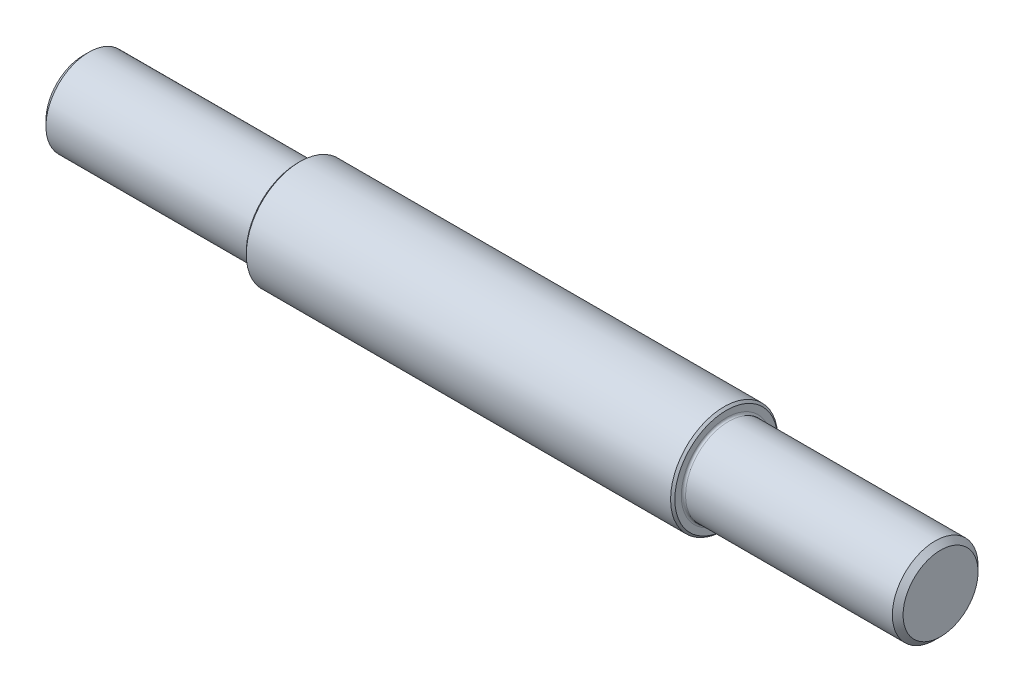
ISO-10303-21;
HEADER;
FILE_DESCRIPTION(('STEP AP214'),'2;1');
FILE_NAME('part.step','',(''),(''),'','','');
FILE_SCHEMA(('AUTOMOTIVE_DESIGN { 1 0 10303 214 1 1 1 1 }'));
ENDSEC;
DATA;
#1=APPLICATION_CONTEXT('core data for automotive mechanical design processes');
#2=APPLICATION_PROTOCOL_DEFINITION('international standard','automotive_design',2000,#1);
#3=PRODUCT_CONTEXT('',#1,'mechanical');
#4=PRODUCT('Part','Part','',(#3));
#5=PRODUCT_RELATED_PRODUCT_CATEGORY('part','',(#4));
#6=PRODUCT_DEFINITION_FORMATION('','',#4);
#7=PRODUCT_DEFINITION_CONTEXT('part definition',#1,'design');
#8=PRODUCT_DEFINITION('design','',#6,#7);
#9=PRODUCT_DEFINITION_SHAPE('','',#8);
#10=(LENGTH_UNIT() NAMED_UNIT(*) SI_UNIT(.MILLI.,.METRE.));
#11=(NAMED_UNIT(*) PLANE_ANGLE_UNIT() SI_UNIT($,.RADIAN.));
#12=(NAMED_UNIT(*) SI_UNIT($,.STERADIAN.) SOLID_ANGLE_UNIT());
#13=UNCERTAINTY_MEASURE_WITH_UNIT(LENGTH_MEASURE(1.E-05),#10,'distance_accuracy_value','');
#14=(GEOMETRIC_REPRESENTATION_CONTEXT(3) GLOBAL_UNCERTAINTY_ASSIGNED_CONTEXT((#13)) GLOBAL_UNIT_ASSIGNED_CONTEXT((#10,
#11,#12)) REPRESENTATION_CONTEXT('',''));
#15=CARTESIAN_POINT('',(0.,0.,0.));
#16=DIRECTION('',(0.,0.,1.));
#17=DIRECTION('',(1.,0.,0.));
#18=AXIS2_PLACEMENT_3D('',#15,#16,#17);
#19=CARTESIAN_POINT('',(80.,4.,0.));
#20=DIRECTION('',(-1.,0.,0.));
#21=DIRECTION('',(0.,0.,1.));
#22=AXIS2_PLACEMENT_3D('',#19,#20,#21);
#23=PLANE('',#22);
#24=CARTESIAN_POINT('',(80.,0.,0.));
#25=DIRECTION('',(-1.,0.,0.));
#26=DIRECTION('',(0.,0.,1.));
#27=AXIS2_PLACEMENT_3D('',#24,#25,#26);
#28=CIRCLE('',#27,3.50000000000001);
#29=CARTESIAN_POINT('',(80.,0.,3.50000000000001));
#30=VERTEX_POINT('',#29);
#31=EDGE_CURVE('E55',#30,#30,#28,.F.);
#32=ORIENTED_EDGE('',*,*,#31,.T.);
#33=EDGE_LOOP('',(#32));
#34=FACE_BOUND('',#33,.T.);
#35=ADVANCED_FACE('F35',(#34),#23,.F.);
#36=CARTESIAN_POINT('',(0.,0.,0.));
#37=DIRECTION('',(-1.,0.,0.));
#38=DIRECTION('',(0.,0.,1.));
#39=AXIS2_PLACEMENT_3D('',#36,#37,#38);
#40=CYLINDRICAL_SURFACE('',#39,4.);
#41=CARTESIAN_POINT('',(60.2,0.,0.));
#42=DIRECTION('',(-1.,0.,0.));
#43=DIRECTION('',(0.,0.,1.));
#44=AXIS2_PLACEMENT_3D('',#41,#42,#43);
#45=CIRCLE('',#44,4.);
#46=CARTESIAN_POINT('',(60.2,0.,4.));
#47=VERTEX_POINT('',#46);
#48=EDGE_CURVE('E10',#47,#47,#45,.F.);
#49=ORIENTED_EDGE('',*,*,#48,.T.);
#50=EDGE_LOOP('',(#49));
#51=FACE_BOUND('',#50,.T.);
#52=CARTESIAN_POINT('',(79.5,0.,0.));
#53=DIRECTION('',(-1.,0.,0.));
#54=DIRECTION('',(0.,0.,1.));
#55=AXIS2_PLACEMENT_3D('',#52,#53,#54);
#56=CIRCLE('',#55,4.);
#57=CARTESIAN_POINT('',(79.5,0.,4.));
#58=VERTEX_POINT('',#57);
#59=EDGE_CURVE('E58',#58,#58,#56,.T.);
#60=ORIENTED_EDGE('',*,*,#59,.T.);
#61=EDGE_LOOP('',(#60));
#62=FACE_BOUND('',#61,.T.);
#63=ADVANCED_FACE('F101',(#51,#62),#40,.T.);
#64=CARTESIAN_POINT('',(60.,4.,0.));
#65=DIRECTION('',(-1.,0.,0.));
#66=DIRECTION('',(0.,0.,1.));
#67=AXIS2_PLACEMENT_3D('',#64,#65,#66);
#68=PLANE('',#67);
#69=CARTESIAN_POINT('',(60.,0.,0.));
#70=DIRECTION('',(-1.,0.,0.));
#71=DIRECTION('',(0.,0.,1.));
#72=AXIS2_PLACEMENT_3D('',#69,#70,#71);
#73=CIRCLE('',#72,4.2);
#74=CARTESIAN_POINT('',(60.,0.,4.2));
#75=VERTEX_POINT('',#74);
#76=EDGE_CURVE('E42',#75,#75,#73,.T.);
#77=ORIENTED_EDGE('',*,*,#76,.T.);
#78=EDGE_LOOP('',(#77));
#79=FACE_BOUND('',#78,.T.);
#80=CARTESIAN_POINT('',(60.,0.,0.));
#81=DIRECTION('',(-1.,0.,0.));
#82=DIRECTION('',(0.,0.,1.));
#83=AXIS2_PLACEMENT_3D('',#80,#81,#82);
#84=CIRCLE('',#83,4.80000000000001);
#85=CARTESIAN_POINT('',(60.,0.,4.80000000000001));
#86=VERTEX_POINT('',#85);
#87=EDGE_CURVE('E73',#86,#86,#84,.F.);
#88=ORIENTED_EDGE('',*,*,#87,.T.);
#89=EDGE_LOOP('',(#88));
#90=FACE_BOUND('',#89,.T.);
#91=ADVANCED_FACE('F106',(#79,#90),#68,.F.);
#92=CARTESIAN_POINT('',(0.,0.,0.));
#93=DIRECTION('',(-1.,0.,0.));
#94=DIRECTION('',(0.,0.,1.));
#95=AXIS2_PLACEMENT_3D('',#92,#93,#94);
#96=CYLINDRICAL_SURFACE('',#95,5.);
#97=CARTESIAN_POINT('',(20.2,0.,0.));
#98=DIRECTION('',(1.,0.,0.));
#99=DIRECTION('',(0.,0.,-1.));
#100=AXIS2_PLACEMENT_3D('',#97,#98,#99);
#101=CIRCLE('',#100,5.);
#102=CARTESIAN_POINT('',(20.2,0.,-5.));
#103=VERTEX_POINT('',#102);
#104=EDGE_CURVE('E67',#103,#103,#101,.T.);
#105=ORIENTED_EDGE('',*,*,#104,.T.);
#106=EDGE_LOOP('',(#105));
#107=FACE_BOUND('',#106,.T.);
#108=CARTESIAN_POINT('',(59.8,0.,0.));
#109=DIRECTION('',(-1.,0.,0.));
#110=DIRECTION('',(0.,0.,1.));
#111=AXIS2_PLACEMENT_3D('',#108,#109,#110);
#112=CIRCLE('',#111,5.);
#113=CARTESIAN_POINT('',(59.8,0.,5.));
#114=VERTEX_POINT('',#113);
#115=EDGE_CURVE('E76',#114,#114,#112,.T.);
#116=ORIENTED_EDGE('',*,*,#115,.T.);
#117=EDGE_LOOP('',(#116));
#118=FACE_BOUND('',#117,.T.);
#119=ADVANCED_FACE('F80',(#107,#118),#96,.T.);
#120=CARTESIAN_POINT('',(20.,5.,0.));
#121=DIRECTION('',(1.,0.,0.));
#122=DIRECTION('',(0.,0.,-1.));
#123=AXIS2_PLACEMENT_3D('',#120,#121,#122);
#124=PLANE('',#123);
#125=CARTESIAN_POINT('',(20.,0.,0.));
#126=DIRECTION('',(1.,0.,0.));
#127=DIRECTION('',(0.,0.,-1.));
#128=AXIS2_PLACEMENT_3D('',#125,#126,#127);
#129=CIRCLE('',#128,4.2);
#130=CARTESIAN_POINT('',(20.,0.,-4.2));
#131=VERTEX_POINT('',#130);
#132=EDGE_CURVE('E46',#131,#131,#129,.T.);
#133=ORIENTED_EDGE('',*,*,#132,.T.);
#134=EDGE_LOOP('',(#133));
#135=FACE_BOUND('',#134,.T.);
#136=CARTESIAN_POINT('',(20.,0.,0.));
#137=DIRECTION('',(1.,0.,0.));
#138=DIRECTION('',(0.,0.,-1.));
#139=AXIS2_PLACEMENT_3D('',#136,#137,#138);
#140=CIRCLE('',#139,4.80000000000001);
#141=CARTESIAN_POINT('',(20.,0.,-4.80000000000001));
#142=VERTEX_POINT('',#141);
#143=EDGE_CURVE('E70',#142,#142,#140,.F.);
#144=ORIENTED_EDGE('',*,*,#143,.T.);
#145=EDGE_LOOP('',(#144));
#146=FACE_BOUND('',#145,.T.);
#147=ADVANCED_FACE('F113',(#135,#146),#124,.F.);
#148=CARTESIAN_POINT('',(0.,0.,0.));
#149=DIRECTION('',(-1.,0.,0.));
#150=DIRECTION('',(0.,0.,1.));
#151=AXIS2_PLACEMENT_3D('',#148,#149,#150);
#152=CYLINDRICAL_SURFACE('',#151,4.);
#153=CARTESIAN_POINT('',(19.8,0.,0.));
#154=DIRECTION('',(1.,0.,0.));
#155=DIRECTION('',(0.,0.,-1.));
#156=AXIS2_PLACEMENT_3D('',#153,#154,#155);
#157=CIRCLE('',#156,4.);
#158=CARTESIAN_POINT('',(19.8,0.,-4.));
#159=VERTEX_POINT('',#158);
#160=EDGE_CURVE('E50',#159,#159,#157,.F.);
#161=ORIENTED_EDGE('',*,*,#160,.T.);
#162=EDGE_LOOP('',(#161));
#163=FACE_BOUND('',#162,.T.);
#164=CARTESIAN_POINT('',(0.500000000000002,0.,0.));
#165=DIRECTION('',(1.,0.,0.));
#166=DIRECTION('',(0.,0.,-1.));
#167=AXIS2_PLACEMENT_3D('',#164,#165,#166);
#168=CIRCLE('',#167,4.);
#169=CARTESIAN_POINT('',(0.500000000000002,0.,-4.));
#170=VERTEX_POINT('',#169);
#171=EDGE_CURVE('E61',#170,#170,#168,.T.);
#172=ORIENTED_EDGE('',*,*,#171,.T.);
#173=EDGE_LOOP('',(#172));
#174=FACE_BOUND('',#173,.T.);
#175=ADVANCED_FACE('F95',(#163,#174),#152,.T.);
#176=CARTESIAN_POINT('',(0.,4.,0.));
#177=DIRECTION('',(1.,0.,0.));
#178=DIRECTION('',(0.,0.,-1.));
#179=AXIS2_PLACEMENT_3D('',#176,#177,#178);
#180=PLANE('',#179);
#181=CARTESIAN_POINT('',(0.,0.,0.));
#182=DIRECTION('',(1.,0.,0.));
#183=DIRECTION('',(0.,0.,-1.));
#184=AXIS2_PLACEMENT_3D('',#181,#182,#183);
#185=CIRCLE('',#184,3.5);
#186=CARTESIAN_POINT('',(0.,0.,-3.5));
#187=VERTEX_POINT('',#186);
#188=EDGE_CURVE('E64',#187,#187,#185,.F.);
#189=ORIENTED_EDGE('',*,*,#188,.T.);
#190=EDGE_LOOP('',(#189));
#191=FACE_BOUND('',#190,.T.);
#192=ADVANCED_FACE('F85',(#191),#180,.F.);
#193=CARTESIAN_POINT('',(59.8,0.,0.));
#194=DIRECTION('',(-1.,0.,0.));
#195=DIRECTION('',(0.,0.,1.));
#196=AXIS2_PLACEMENT_3D('',#193,#194,#195);
#197=CONICAL_SURFACE('',#196,5.,0.785398163397438);
#198=ORIENTED_EDGE('',*,*,#87,.F.);
#199=EDGE_LOOP('',(#198));
#200=FACE_BOUND('',#199,.T.);
#201=ORIENTED_EDGE('',*,*,#115,.F.);
#202=EDGE_LOOP('',(#201));
#203=FACE_BOUND('',#202,.T.);
#204=ADVANCED_FACE('F82',(#200,#203),#197,.T.);
#205=CARTESIAN_POINT('',(20.,0.,0.));
#206=DIRECTION('',(1.,0.,0.));
#207=DIRECTION('',(0.,0.,-1.));
#208=AXIS2_PLACEMENT_3D('',#205,#206,#207);
#209=CONICAL_SURFACE('',#208,4.80000000000001,0.785398163397455);
#210=ORIENTED_EDGE('',*,*,#104,.F.);
#211=EDGE_LOOP('',(#210));
#212=FACE_BOUND('',#211,.T.);
#213=ORIENTED_EDGE('',*,*,#143,.F.);
#214=EDGE_LOOP('',(#213));
#215=FACE_BOUND('',#214,.T.);
#216=ADVANCED_FACE('F84',(#212,#215),#209,.T.);
#217=CARTESIAN_POINT('',(0.,0.,0.));
#218=DIRECTION('',(1.,0.,0.));
#219=DIRECTION('',(0.,0.,-1.));
#220=AXIS2_PLACEMENT_3D('',#217,#218,#219);
#221=CONICAL_SURFACE('',#220,3.5,0.785398163397441);
#222=ORIENTED_EDGE('',*,*,#171,.F.);
#223=EDGE_LOOP('',(#222));
#224=FACE_BOUND('',#223,.T.);
#225=ORIENTED_EDGE('',*,*,#188,.F.);
#226=EDGE_LOOP('',(#225));
#227=FACE_BOUND('',#226,.T.);
#228=ADVANCED_FACE('F92',(#224,#227),#221,.T.);
#229=CARTESIAN_POINT('',(79.5,0.,0.));
#230=DIRECTION('',(-1.,0.,0.));
#231=DIRECTION('',(0.,0.,1.));
#232=AXIS2_PLACEMENT_3D('',#229,#230,#231);
#233=CONICAL_SURFACE('',#232,4.,0.785398163397438);
#234=ORIENTED_EDGE('',*,*,#31,.F.);
#235=EDGE_LOOP('',(#234));
#236=FACE_BOUND('',#235,.T.);
#237=ORIENTED_EDGE('',*,*,#59,.F.);
#238=EDGE_LOOP('',(#237));
#239=FACE_BOUND('',#238,.T.);
#240=ADVANCED_FACE('F128',(#236,#239),#233,.T.);
#241=CARTESIAN_POINT('',(19.8,0.,0.));
#242=DIRECTION('',(1.,0.,0.));
#243=DIRECTION('',(0.,0.,-1.));
#244=AXIS2_PLACEMENT_3D('',#241,#242,#243);
#245=TOROIDAL_SURFACE('',#244,4.2,0.2);
#246=ORIENTED_EDGE('',*,*,#132,.F.);
#247=EDGE_LOOP('',(#246));
#248=FACE_BOUND('',#247,.T.);
#249=ORIENTED_EDGE('',*,*,#160,.F.);
#250=EDGE_LOOP('',(#249));
#251=FACE_BOUND('',#250,.T.);
#252=ADVANCED_FACE('F134',(#248,#251),#245,.F.);
#253=CARTESIAN_POINT('',(60.2,0.,0.));
#254=DIRECTION('',(-1.,0.,0.));
#255=DIRECTION('',(0.,0.,1.));
#256=AXIS2_PLACEMENT_3D('',#253,#254,#255);
#257=TOROIDAL_SURFACE('',#256,4.2,0.2);
#258=ORIENTED_EDGE('',*,*,#48,.F.);
#259=EDGE_LOOP('',(#258));
#260=FACE_BOUND('',#259,.T.);
#261=ORIENTED_EDGE('',*,*,#76,.F.);
#262=EDGE_LOOP('',(#261));
#263=FACE_BOUND('',#262,.T.);
#264=ADVANCED_FACE('F37',(#260,#263),#257,.F.);
#265=CLOSED_SHELL('',(#35,#63,#91,#119,#147,#175,#192,#204,#216,#228,#240,#252,#264));
#266=MANIFOLD_SOLID_BREP('B2',#265);
#267=ADVANCED_BREP_SHAPE_REPRESENTATION('',(#18,#266),#14);
#268=SHAPE_DEFINITION_REPRESENTATION(#9,#267);
ENDSEC;
END-ISO-10303-21;
